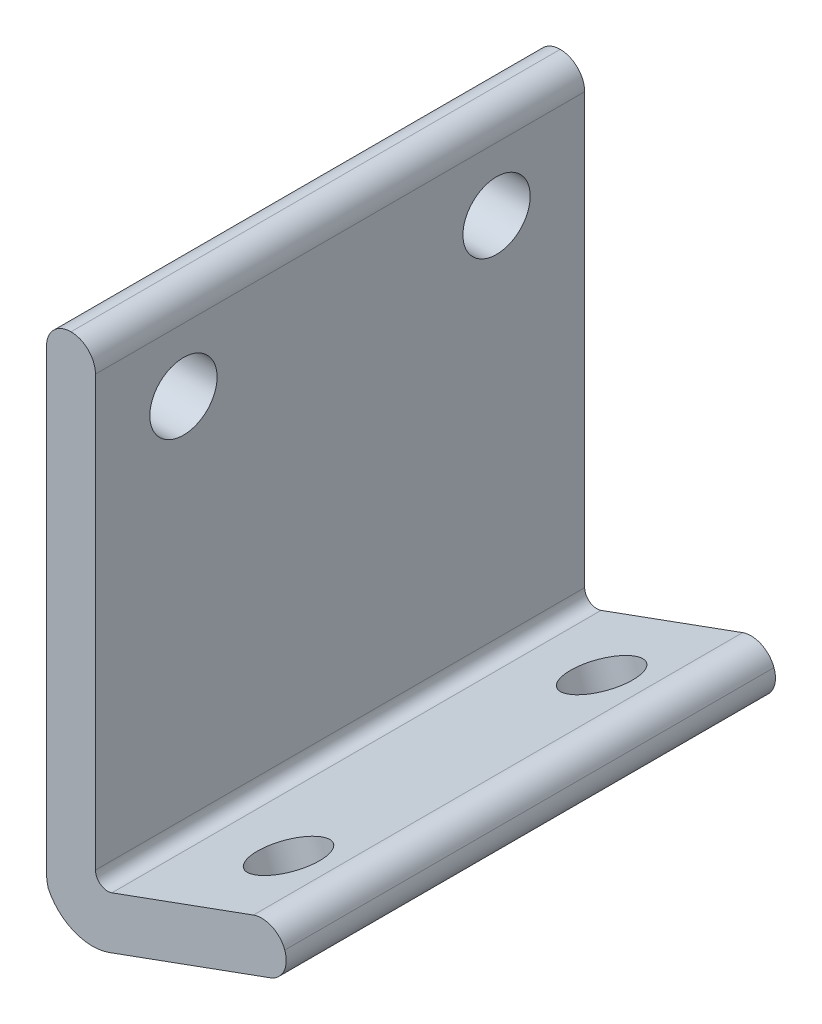
ISO-10303-21;
HEADER;
FILE_DESCRIPTION(('STEP AP214'),'2;1');
FILE_NAME('part.step','',(''),(''),'','','');
FILE_SCHEMA(('AUTOMOTIVE_DESIGN { 1 0 10303 214 1 1 1 1 }'));
ENDSEC;
DATA;
#1=APPLICATION_CONTEXT('core data for automotive mechanical design processes');
#2=APPLICATION_PROTOCOL_DEFINITION('international standard','automotive_design',2000,#1);
#3=PRODUCT_CONTEXT('',#1,'mechanical');
#4=PRODUCT('Part','Part','',(#3));
#5=PRODUCT_RELATED_PRODUCT_CATEGORY('part','',(#4));
#6=PRODUCT_DEFINITION_FORMATION('','',#4);
#7=PRODUCT_DEFINITION_CONTEXT('part definition',#1,'design');
#8=PRODUCT_DEFINITION('design','',#6,#7);
#9=PRODUCT_DEFINITION_SHAPE('','',#8);
#10=(LENGTH_UNIT() NAMED_UNIT(*) SI_UNIT(.MILLI.,.METRE.));
#11=(NAMED_UNIT(*) PLANE_ANGLE_UNIT() SI_UNIT($,.RADIAN.));
#12=(NAMED_UNIT(*) SI_UNIT($,.STERADIAN.) SOLID_ANGLE_UNIT());
#13=UNCERTAINTY_MEASURE_WITH_UNIT(LENGTH_MEASURE(1.E-05),#10,'distance_accuracy_value','');
#14=(GEOMETRIC_REPRESENTATION_CONTEXT(3) GLOBAL_UNCERTAINTY_ASSIGNED_CONTEXT((#13)) GLOBAL_UNIT_ASSIGNED_CONTEXT((#10,
#11,#12)) REPRESENTATION_CONTEXT('',''));
#15=CARTESIAN_POINT('',(0.,0.,0.));
#16=DIRECTION('',(0.,0.,1.));
#17=DIRECTION('',(1.,0.,0.));
#18=AXIS2_PLACEMENT_3D('',#15,#16,#17);
#19=CARTESIAN_POINT('',(0.,0.,0.));
#20=DIRECTION('',(-0.342020143325666,0.93969262078591,0.));
#21=DIRECTION('',(-0.939692620785909,-0.342020143325666,0.));
#22=AXIS2_PLACEMENT_3D('',#19,#20,#21);
#23=PLANE('',#22);
#24=CARTESIAN_POINT('',(6.29249955509349,2.29028253718733,-3.6));
#25=DIRECTION('',(0.342020143325666,-0.93969262078591,0.));
#26=DIRECTION('',(0.939692620785909,0.342020143325666,0.));
#27=AXIS2_PLACEMENT_3D('',#24,#25,#26);
#28=CIRCLE('',#27,1.35);
#29=CARTESIAN_POINT('',(7.56108459315447,2.75200973067698,-3.6));
#30=VERTEX_POINT('',#29);
#31=EDGE_CURVE('E160',#30,#30,#28,.T.);
#32=ORIENTED_EDGE('',*,*,#31,.T.);
#33=EDGE_LOOP('',(#32));
#34=FACE_BOUND('',#33,.T.);
#35=CARTESIAN_POINT('',(6.29249955509349,2.29028253718733,-16.4));
#36=DIRECTION('',(0.342020143325666,-0.93969262078591,0.));
#37=DIRECTION('',(0.939692620785909,0.342020143325666,0.));
#38=AXIS2_PLACEMENT_3D('',#35,#36,#37);
#39=CIRCLE('',#38,1.35);
#40=CARTESIAN_POINT('',(7.56108459315447,2.75200973067698,-16.4));
#41=VERTEX_POINT('',#40);
#42=EDGE_CURVE('E266',#41,#41,#39,.T.);
#43=ORIENTED_EDGE('',*,*,#42,.T.);
#44=EDGE_LOOP('',(#43));
#45=FACE_BOUND('',#44,.T.);
#46=DIRECTION('',(-0.939692620785909,-0.342020143325666,0.));
#47=VECTOR('',#46,1.);
#48=CARTESIAN_POINT('',(0.,0.,0.));
#49=LINE('',#48,#47);
#50=CARTESIAN_POINT('',(8.45723358707319,3.078181289931,0.));
#51=VERTEX_POINT('',#50);
#52=CARTESIAN_POINT('',(2.67101007166283,0.972168161510499,0.));
#53=VERTEX_POINT('',#52);
#54=EDGE_CURVE('E152',#51,#53,#49,.T.);
#55=ORIENTED_EDGE('',*,*,#54,.F.);
#56=DIRECTION('',(0.,0.,1.));
#57=VECTOR('',#56,1.);
#58=CARTESIAN_POINT('',(8.45723358707319,3.078181289931,-20.));
#59=LINE('',#58,#57);
#60=CARTESIAN_POINT('',(8.45723358707319,3.078181289931,-20.));
#61=VERTEX_POINT('',#60);
#62=EDGE_CURVE('E11',#51,#61,#59,.F.);
#63=ORIENTED_EDGE('',*,*,#62,.T.);
#64=DIRECTION('',(0.939692620785909,0.342020143325666,0.));
#65=VECTOR('',#64,1.);
#66=CARTESIAN_POINT('',(9.39692620785909,3.42020143325666,-20.));
#67=LINE('',#66,#65);
#68=CARTESIAN_POINT('',(2.67101007166283,0.972168161510499,-20.));
#69=VERTEX_POINT('',#68);
#70=EDGE_CURVE('E157',#69,#61,#67,.T.);
#71=ORIENTED_EDGE('',*,*,#70,.F.);
#72=DIRECTION('',(0.,0.,1.));
#73=VECTOR('',#72,1.);
#74=CARTESIAN_POINT('',(2.67101007166283,0.972168161510499,0.));
#75=LINE('',#74,#73);
#76=EDGE_CURVE('E177',#69,#53,#75,.T.);
#77=ORIENTED_EDGE('',*,*,#76,.T.);
#78=EDGE_LOOP('',(#55,#63,#71,#77));
#79=FACE_BOUND('',#78,.T.);
#80=ADVANCED_FACE('F39',(#34,#45,#79),#23,.T.);
#81=CARTESIAN_POINT('',(0.684040286651332,-1.87938524157182,0.));
#82=DIRECTION('',(-0.342020143325666,0.93969262078591,0.));
#83=DIRECTION('',(-0.939692620785909,-0.342020143325666,0.));
#84=AXIS2_PLACEMENT_3D('',#81,#82,#83);
#85=PLANE('',#84);
#86=DIRECTION('',(0.939692620785909,0.342020143325666,0.));
#87=VECTOR('',#86,1.);
#88=CARTESIAN_POINT('',(10.0809664945104,1.54081619168484,-20.));
#89=LINE('',#88,#87);
#90=CARTESIAN_POINT('',(2.56342552822315,-1.19534495492049,-20.));
#91=VERTEX_POINT('',#90);
#92=CARTESIAN_POINT('',(9.14127387372451,1.19879604835918,-20.));
#93=VERTEX_POINT('',#92);
#94=EDGE_CURVE('E142',#91,#93,#89,.T.);
#95=ORIENTED_EDGE('',*,*,#94,.T.);
#96=DIRECTION('',(0.,0.,1.));
#97=VECTOR('',#96,1.);
#98=CARTESIAN_POINT('',(9.14127387372451,1.19879604835918,0.));
#99=LINE('',#98,#97);
#100=CARTESIAN_POINT('',(9.14127387372451,1.19879604835918,0.));
#101=VERTEX_POINT('',#100);
#102=EDGE_CURVE('E214',#93,#101,#99,.T.);
#103=ORIENTED_EDGE('',*,*,#102,.T.);
#104=DIRECTION('',(-0.939692620785909,-0.342020143325666,0.));
#105=VECTOR('',#104,1.);
#106=CARTESIAN_POINT('',(0.684040286651332,-1.87938524157182,0.));
#107=LINE('',#106,#105);
#108=CARTESIAN_POINT('',(2.56342552822315,-1.19534495492049,0.));
#109=VERTEX_POINT('',#108);
#110=EDGE_CURVE('E145',#101,#109,#107,.T.);
#111=ORIENTED_EDGE('',*,*,#110,.T.);
#112=DIRECTION('',(0.,0.,-1.));
#113=VECTOR('',#112,1.);
#114=CARTESIAN_POINT('',(2.56342552822315,-1.19534495492049,0.));
#115=LINE('',#114,#113);
#116=EDGE_CURVE('E128',#109,#91,#115,.T.);
#117=ORIENTED_EDGE('',*,*,#116,.T.);
#118=EDGE_LOOP('',(#95,#103,#111,#117));
#119=FACE_BOUND('',#118,.T.);
#120=CARTESIAN_POINT('',(6.97653984174482,0.410897295615512,-3.6));
#121=DIRECTION('',(0.342020143325666,-0.93969262078591,0.));
#122=DIRECTION('',(0.939692620785909,0.342020143325666,0.));
#123=AXIS2_PLACEMENT_3D('',#120,#121,#122);
#124=CIRCLE('',#123,1.35);
#125=CARTESIAN_POINT('',(8.2451248798058,0.872624489105162,-3.6));
#126=VERTEX_POINT('',#125);
#127=EDGE_CURVE('E164',#126,#126,#124,.T.);
#128=ORIENTED_EDGE('',*,*,#127,.F.);
#129=EDGE_LOOP('',(#128));
#130=FACE_BOUND('',#129,.T.);
#131=CARTESIAN_POINT('',(6.97653984174482,0.410897295615512,-16.4));
#132=DIRECTION('',(0.342020143325666,-0.93969262078591,0.));
#133=DIRECTION('',(0.939692620785909,0.342020143325666,0.));
#134=AXIS2_PLACEMENT_3D('',#131,#132,#133);
#135=CIRCLE('',#134,1.35);
#136=CARTESIAN_POINT('',(8.2451248798058,0.872624489105161,-16.4));
#137=VERTEX_POINT('',#136);
#138=EDGE_CURVE('E270',#137,#137,#135,.T.);
#139=ORIENTED_EDGE('',*,*,#138,.F.);
#140=EDGE_LOOP('',(#139));
#141=FACE_BOUND('',#140,.T.);
#142=ADVANCED_FACE('F139',(#119,#130,#141),#85,.F.);
#143=CARTESIAN_POINT('',(10.0809664945104,1.54081619168484,-20.));
#144=DIRECTION('',(0.,0.,1.));
#145=DIRECTION('',(1.,0.,0.));
#146=AXIS2_PLACEMENT_3D('',#143,#144,#145);
#147=PLANE('',#146);
#148=CARTESIAN_POINT('',(8.79925373039885,2.13848866914509,-20.));
#149=DIRECTION('',(0.,0.,1.));
#150=DIRECTION('',(1.,0.,0.));
#151=AXIS2_PLACEMENT_3D('',#148,#149,#150);
#152=CIRCLE('',#151,1.);
#153=CARTESIAN_POINT('',(9.73894635118476,2.48050881247075,-20.));
#154=VERTEX_POINT('',#153);
#155=EDGE_CURVE('E56',#61,#154,#152,.F.);
#156=ORIENTED_EDGE('',*,*,#155,.T.);
#157=CARTESIAN_POINT('',(8.79925373039885,2.13848866914509,-20.));
#158=DIRECTION('',(0.,0.,1.));
#159=DIRECTION('',(1.,0.,0.));
#160=AXIS2_PLACEMENT_3D('',#157,#158,#159);
#161=CIRCLE('',#160,1.);
#162=EDGE_CURVE('E49',#154,#93,#161,.F.);
#163=ORIENTED_EDGE('',*,*,#162,.T.);
#164=ORIENTED_EDGE('',*,*,#94,.F.);
#165=CARTESIAN_POINT('',(1.87938524157182,0.684040286651332,-20.));
#166=DIRECTION('',(0.,0.,1.));
#167=DIRECTION('',(1.,0.,0.));
#168=AXIS2_PLACEMENT_3D('',#165,#166,#167);
#169=CIRCLE('',#168,2.);
#170=CARTESIAN_POINT('',(0.0676256716358873,-0.163029522010014,-20.));
#171=VERTEX_POINT('',#170);
#172=EDGE_CURVE('E124',#91,#171,#169,.F.);
#173=ORIENTED_EDGE('',*,*,#172,.T.);
#174=CARTESIAN_POINT('',(2.,0.352653961416928,-20.));
#175=DIRECTION('',(0.,0.,1.));
#176=DIRECTION('',(1.,0.,0.));
#177=AXIS2_PLACEMENT_3D('',#174,#175,#176);
#178=CIRCLE('',#177,2.);
#179=CARTESIAN_POINT('',(0.,0.352653961416927,-20.));
#180=VERTEX_POINT('',#179);
#181=EDGE_CURVE('E135',#171,#180,#178,.F.);
#182=ORIENTED_EDGE('',*,*,#181,.T.);
#183=DIRECTION('',(0.,1.,0.));
#184=VECTOR('',#183,1.);
#185=CARTESIAN_POINT('',(0.,20.,-20.));
#186=LINE('',#185,#184);
#187=CARTESIAN_POINT('',(0.,19.,-20.));
#188=VERTEX_POINT('',#187);
#189=EDGE_CURVE('E252',#180,#188,#186,.T.);
#190=ORIENTED_EDGE('',*,*,#189,.T.);
#191=CARTESIAN_POINT('',(1.,19.,-20.));
#192=DIRECTION('',(0.,0.,1.));
#193=DIRECTION('',(1.,0.,0.));
#194=AXIS2_PLACEMENT_3D('',#191,#192,#193);
#195=CIRCLE('',#194,1.);
#196=CARTESIAN_POINT('',(1.,20.,-20.));
#197=VERTEX_POINT('',#196);
#198=EDGE_CURVE('E205',#188,#197,#195,.F.);
#199=ORIENTED_EDGE('',*,*,#198,.T.);
#200=CARTESIAN_POINT('',(1.,19.,-20.));
#201=DIRECTION('',(0.,0.,1.));
#202=DIRECTION('',(1.,0.,0.));
#203=AXIS2_PLACEMENT_3D('',#200,#201,#202);
#204=CIRCLE('',#203,1.);
#205=CARTESIAN_POINT('',(2.,19.,-20.));
#206=VERTEX_POINT('',#205);
#207=EDGE_CURVE('E208',#197,#206,#204,.F.);
#208=ORIENTED_EDGE('',*,*,#207,.T.);
#209=DIRECTION('',(0.,1.,0.));
#210=VECTOR('',#209,1.);
#211=CARTESIAN_POINT('',(2.,20.,-20.));
#212=LINE('',#211,#210);
#213=CARTESIAN_POINT('',(2.,1.44201447190345,-20.));
#214=VERTEX_POINT('',#213);
#215=EDGE_CURVE('E259',#214,#206,#212,.T.);
#216=ORIENTED_EDGE('',*,*,#215,.F.);
#217=CARTESIAN_POINT('',(2.5,1.44201447190345,-20.));
#218=DIRECTION('',(0.,0.,1.));
#219=DIRECTION('',(1.,0.,0.));
#220=AXIS2_PLACEMENT_3D('',#217,#218,#219);
#221=CIRCLE('',#220,0.5);
#222=EDGE_CURVE('E192',#214,#69,#221,.T.);
#223=ORIENTED_EDGE('',*,*,#222,.T.);
#224=ORIENTED_EDGE('',*,*,#70,.T.);
#225=EDGE_LOOP('',(#156,#163,#164,#173,#182,#190,#199,#208,#216,#223,#224));
#226=FACE_BOUND('',#225,.T.);
#227=ADVANCED_FACE('F149',(#226),#147,.F.);
#228=CARTESIAN_POINT('',(0.684040286651332,-1.87938524157182,0.));
#229=DIRECTION('',(0.,0.,-1.));
#230=DIRECTION('',(-1.,0.,0.));
#231=AXIS2_PLACEMENT_3D('',#228,#229,#230);
#232=PLANE('',#231);
#233=ORIENTED_EDGE('',*,*,#110,.F.);
#234=CARTESIAN_POINT('',(8.79925373039885,2.13848866914509,0.));
#235=DIRECTION('',(0.,0.,-1.));
#236=DIRECTION('',(-1.,0.,0.));
#237=AXIS2_PLACEMENT_3D('',#234,#235,#236);
#238=CIRCLE('',#237,1.);
#239=CARTESIAN_POINT('',(9.73894635118476,2.48050881247075,0.));
#240=VERTEX_POINT('',#239);
#241=EDGE_CURVE('E223',#101,#240,#238,.F.);
#242=ORIENTED_EDGE('',*,*,#241,.T.);
#243=CARTESIAN_POINT('',(8.79925373039885,2.13848866914509,0.));
#244=DIRECTION('',(0.,0.,-1.));
#245=DIRECTION('',(-1.,0.,0.));
#246=AXIS2_PLACEMENT_3D('',#243,#244,#245);
#247=CIRCLE('',#246,1.);
#248=EDGE_CURVE('E220',#240,#51,#247,.F.);
#249=ORIENTED_EDGE('',*,*,#248,.T.);
#250=ORIENTED_EDGE('',*,*,#54,.T.);
#251=CARTESIAN_POINT('',(2.5,1.44201447190345,0.));
#252=DIRECTION('',(0.,0.,-1.));
#253=DIRECTION('',(-1.,0.,0.));
#254=AXIS2_PLACEMENT_3D('',#251,#252,#253);
#255=CIRCLE('',#254,0.5);
#256=CARTESIAN_POINT('',(2.,1.44201447190345,0.));
#257=VERTEX_POINT('',#256);
#258=EDGE_CURVE('E188',#53,#257,#255,.T.);
#259=ORIENTED_EDGE('',*,*,#258,.T.);
#260=DIRECTION('',(0.,-1.,0.));
#261=VECTOR('',#260,1.);
#262=CARTESIAN_POINT('',(2.,0.,0.));
#263=LINE('',#262,#261);
#264=CARTESIAN_POINT('',(2.,19.,0.));
#265=VERTEX_POINT('',#264);
#266=EDGE_CURVE('E263',#265,#257,#263,.T.);
#267=ORIENTED_EDGE('',*,*,#266,.F.);
#268=CARTESIAN_POINT('',(1.,19.,0.));
#269=DIRECTION('',(0.,0.,-1.));
#270=DIRECTION('',(-1.,0.,0.));
#271=AXIS2_PLACEMENT_3D('',#268,#269,#270);
#272=CIRCLE('',#271,1.);
#273=CARTESIAN_POINT('',(1.,20.,0.));
#274=VERTEX_POINT('',#273);
#275=EDGE_CURVE('E202',#265,#274,#272,.F.);
#276=ORIENTED_EDGE('',*,*,#275,.T.);
#277=CARTESIAN_POINT('',(1.,19.,0.));
#278=DIRECTION('',(0.,0.,-1.));
#279=DIRECTION('',(-1.,0.,0.));
#280=AXIS2_PLACEMENT_3D('',#277,#278,#279);
#281=CIRCLE('',#280,1.);
#282=CARTESIAN_POINT('',(0.,19.,0.));
#283=VERTEX_POINT('',#282);
#284=EDGE_CURVE('E199',#274,#283,#281,.F.);
#285=ORIENTED_EDGE('',*,*,#284,.T.);
#286=DIRECTION('',(0.,-1.,0.));
#287=VECTOR('',#286,1.);
#288=CARTESIAN_POINT('',(0.,0.,0.));
#289=LINE('',#288,#287);
#290=CARTESIAN_POINT('',(0.,0.352653961416928,0.));
#291=VERTEX_POINT('',#290);
#292=EDGE_CURVE('E256',#283,#291,#289,.T.);
#293=ORIENTED_EDGE('',*,*,#292,.T.);
#294=CARTESIAN_POINT('',(2.,0.352653961416928,0.));
#295=DIRECTION('',(0.,0.,-1.));
#296=DIRECTION('',(-1.,0.,0.));
#297=AXIS2_PLACEMENT_3D('',#294,#295,#296);
#298=CIRCLE('',#297,2.);
#299=CARTESIAN_POINT('',(0.0676256716358873,-0.163029522010014,0.));
#300=VERTEX_POINT('',#299);
#301=EDGE_CURVE('E134',#291,#300,#298,.F.);
#302=ORIENTED_EDGE('',*,*,#301,.T.);
#303=CARTESIAN_POINT('',(1.87938524157182,0.684040286651332,0.));
#304=DIRECTION('',(0.,0.,-1.));
#305=DIRECTION('',(-1.,0.,0.));
#306=AXIS2_PLACEMENT_3D('',#303,#304,#305);
#307=CIRCLE('',#306,2.);
#308=EDGE_CURVE('E170',#300,#109,#307,.F.);
#309=ORIENTED_EDGE('',*,*,#308,.T.);
#310=EDGE_LOOP('',(#233,#242,#249,#250,#259,#267,#276,#285,#293,#302,#309));
#311=FACE_BOUND('',#310,.T.);
#312=ADVANCED_FACE('F231',(#311),#232,.F.);
#313=CARTESIAN_POINT('',(6.97653984174482,0.410897295615512,-3.6));
#314=DIRECTION('',(-0.342020143325666,0.939692620785909,0.));
#315=DIRECTION('',(-0.93969262078591,-0.342020143325666,0.));
#316=AXIS2_PLACEMENT_3D('',#313,#314,#315);
#317=CYLINDRICAL_SURFACE('',#316,1.35);
#318=ORIENTED_EDGE('',*,*,#127,.T.);
#319=EDGE_LOOP('',(#318));
#320=FACE_BOUND('',#319,.T.);
#321=ORIENTED_EDGE('',*,*,#31,.F.);
#322=EDGE_LOOP('',(#321));
#323=FACE_BOUND('',#322,.T.);
#324=ADVANCED_FACE('F280',(#320,#323),#317,.F.);
#325=CARTESIAN_POINT('',(6.97653984174482,0.410897295615512,-16.4));
#326=DIRECTION('',(-0.342020143325666,0.939692620785909,0.));
#327=DIRECTION('',(-0.93969262078591,-0.342020143325666,0.));
#328=AXIS2_PLACEMENT_3D('',#325,#326,#327);
#329=CYLINDRICAL_SURFACE('',#328,1.35);
#330=ORIENTED_EDGE('',*,*,#138,.T.);
#331=EDGE_LOOP('',(#330));
#332=FACE_BOUND('',#331,.T.);
#333=ORIENTED_EDGE('',*,*,#42,.F.);
#334=EDGE_LOOP('',(#333));
#335=FACE_BOUND('',#334,.T.);
#336=ADVANCED_FACE('F287',(#332,#335),#329,.F.);
#337=CARTESIAN_POINT('',(2.,0.,0.));
#338=DIRECTION('',(-1.,0.,0.));
#339=DIRECTION('',(0.,0.,1.));
#340=AXIS2_PLACEMENT_3D('',#337,#338,#339);
#341=PLANE('',#340);
#342=ORIENTED_EDGE('',*,*,#215,.T.);
#343=DIRECTION('',(0.,0.,1.));
#344=VECTOR('',#343,1.);
#345=CARTESIAN_POINT('',(2.,19.,0.));
#346=LINE('',#345,#344);
#347=EDGE_CURVE('E195',#206,#265,#346,.T.);
#348=ORIENTED_EDGE('',*,*,#347,.T.);
#349=ORIENTED_EDGE('',*,*,#266,.T.);
#350=DIRECTION('',(0.,0.,1.));
#351=VECTOR('',#350,1.);
#352=CARTESIAN_POINT('',(2.,1.44201447190345,0.));
#353=LINE('',#352,#351);
#354=EDGE_CURVE('E185',#257,#214,#353,.F.);
#355=ORIENTED_EDGE('',*,*,#354,.T.);
#356=EDGE_LOOP('',(#342,#348,#349,#355));
#357=FACE_BOUND('',#356,.T.);
#358=CARTESIAN_POINT('',(2.,16.4156081962162,-3.59710060147989));
#359=DIRECTION('',(1.,0.,0.));
#360=DIRECTION('',(0.,0.,-1.));
#361=AXIS2_PLACEMENT_3D('',#358,#359,#360);
#362=CIRCLE('',#361,1.375);
#363=CARTESIAN_POINT('',(2.,16.4156081962162,-4.97210060147989));
#364=VERTEX_POINT('',#363);
#365=EDGE_CURVE('E248',#364,#364,#362,.T.);
#366=ORIENTED_EDGE('',*,*,#365,.F.);
#367=EDGE_LOOP('',(#366));
#368=FACE_BOUND('',#367,.T.);
#369=CARTESIAN_POINT('',(2.,16.4156081962162,-16.3971006014799));
#370=DIRECTION('',(1.,0.,0.));
#371=DIRECTION('',(0.,0.,-1.));
#372=AXIS2_PLACEMENT_3D('',#369,#370,#371);
#373=CIRCLE('',#372,1.375);
#374=CARTESIAN_POINT('',(2.,16.4156081962162,-17.7721006014799));
#375=VERTEX_POINT('',#374);
#376=EDGE_CURVE('E240',#375,#375,#373,.T.);
#377=ORIENTED_EDGE('',*,*,#376,.F.);
#378=EDGE_LOOP('',(#377));
#379=FACE_BOUND('',#378,.T.);
#380=ADVANCED_FACE('F290',(#357,#368,#379),#341,.F.);
#381=CARTESIAN_POINT('',(0.,0.,0.));
#382=DIRECTION('',(-1.,0.,0.));
#383=DIRECTION('',(0.,0.,1.));
#384=AXIS2_PLACEMENT_3D('',#381,#382,#383);
#385=PLANE('',#384);
#386=CARTESIAN_POINT('',(0.,16.4156081962162,-3.59710060147989));
#387=DIRECTION('',(1.,0.,0.));
#388=DIRECTION('',(0.,0.,-1.));
#389=AXIS2_PLACEMENT_3D('',#386,#387,#388);
#390=CIRCLE('',#389,1.375);
#391=CARTESIAN_POINT('',(0.,16.4156081962162,-4.97210060147989));
#392=VERTEX_POINT('',#391);
#393=EDGE_CURVE('E244',#392,#392,#390,.T.);
#394=ORIENTED_EDGE('',*,*,#393,.T.);
#395=EDGE_LOOP('',(#394));
#396=FACE_BOUND('',#395,.T.);
#397=ORIENTED_EDGE('',*,*,#292,.F.);
#398=DIRECTION('',(0.,0.,1.));
#399=VECTOR('',#398,1.);
#400=CARTESIAN_POINT('',(0.,19.,-20.));
#401=LINE('',#400,#399);
#402=EDGE_CURVE('E211',#283,#188,#401,.F.);
#403=ORIENTED_EDGE('',*,*,#402,.T.);
#404=ORIENTED_EDGE('',*,*,#189,.F.);
#405=DIRECTION('',(0.,0.,-1.));
#406=VECTOR('',#405,1.);
#407=CARTESIAN_POINT('',(0.,0.352653961416928,0.));
#408=LINE('',#407,#406);
#409=EDGE_CURVE('E173',#180,#291,#408,.F.);
#410=ORIENTED_EDGE('',*,*,#409,.T.);
#411=EDGE_LOOP('',(#397,#403,#404,#410));
#412=FACE_BOUND('',#411,.T.);
#413=CARTESIAN_POINT('',(0.,16.4156081962162,-16.3971006014799));
#414=DIRECTION('',(1.,0.,0.));
#415=DIRECTION('',(0.,0.,-1.));
#416=AXIS2_PLACEMENT_3D('',#413,#414,#415);
#417=CIRCLE('',#416,1.375);
#418=CARTESIAN_POINT('',(0.,16.4156081962162,-17.7721006014799));
#419=VERTEX_POINT('',#418);
#420=EDGE_CURVE('E180',#419,#419,#417,.T.);
#421=ORIENTED_EDGE('',*,*,#420,.T.);
#422=EDGE_LOOP('',(#421));
#423=FACE_BOUND('',#422,.T.);
#424=ADVANCED_FACE('F320',(#396,#412,#423),#385,.T.);
#425=CARTESIAN_POINT('',(2.,16.4156081962162,-3.59710060147989));
#426=DIRECTION('',(-1.,0.,0.));
#427=DIRECTION('',(0.,0.,1.));
#428=AXIS2_PLACEMENT_3D('',#425,#426,#427);
#429=CYLINDRICAL_SURFACE('',#428,1.375);
#430=ORIENTED_EDGE('',*,*,#365,.T.);
#431=EDGE_LOOP('',(#430));
#432=FACE_BOUND('',#431,.T.);
#433=ORIENTED_EDGE('',*,*,#393,.F.);
#434=EDGE_LOOP('',(#433));
#435=FACE_BOUND('',#434,.T.);
#436=ADVANCED_FACE('F334',(#432,#435),#429,.F.);
#437=CARTESIAN_POINT('',(2.,16.4156081962162,-16.3971006014799));
#438=DIRECTION('',(-1.,0.,0.));
#439=DIRECTION('',(0.,0.,1.));
#440=AXIS2_PLACEMENT_3D('',#437,#438,#439);
#441=CYLINDRICAL_SURFACE('',#440,1.375);
#442=ORIENTED_EDGE('',*,*,#376,.T.);
#443=EDGE_LOOP('',(#442));
#444=FACE_BOUND('',#443,.T.);
#445=ORIENTED_EDGE('',*,*,#420,.F.);
#446=EDGE_LOOP('',(#445));
#447=FACE_BOUND('',#446,.T.);
#448=ADVANCED_FACE('F327',(#444,#447),#441,.F.);
#449=CARTESIAN_POINT('',(2.,0.352653961416928,-20.));
#450=DIRECTION('',(0.,0.,1.));
#451=DIRECTION('',(1.,0.,0.));
#452=AXIS2_PLACEMENT_3D('',#449,#450,#451);
#453=CYLINDRICAL_SURFACE('',#452,2.);
#454=DIRECTION('',(0.,0.,1.));
#455=VECTOR('',#454,1.);
#456=CARTESIAN_POINT('',(0.0676256716358873,-0.163029522010014,-10.));
#457=LINE('',#456,#455);
#458=EDGE_CURVE('E130',#300,#171,#457,.F.);
#459=ORIENTED_EDGE('',*,*,#458,.F.);
#460=ORIENTED_EDGE('',*,*,#301,.F.);
#461=ORIENTED_EDGE('',*,*,#409,.F.);
#462=ORIENTED_EDGE('',*,*,#181,.F.);
#463=EDGE_LOOP('',(#459,#460,#461,#462));
#464=FACE_BOUND('',#463,.T.);
#465=ADVANCED_FACE('F324',(#464),#453,.T.);
#466=CARTESIAN_POINT('',(1.87938524157182,0.684040286651332,0.));
#467=DIRECTION('',(0.,0.,-1.));
#468=DIRECTION('',(-1.,0.,0.));
#469=AXIS2_PLACEMENT_3D('',#466,#467,#468);
#470=CYLINDRICAL_SURFACE('',#469,2.);
#471=ORIENTED_EDGE('',*,*,#308,.F.);
#472=ORIENTED_EDGE('',*,*,#458,.T.);
#473=ORIENTED_EDGE('',*,*,#172,.F.);
#474=ORIENTED_EDGE('',*,*,#116,.F.);
#475=EDGE_LOOP('',(#471,#472,#473,#474));
#476=FACE_BOUND('',#475,.T.);
#477=ADVANCED_FACE('F127',(#476),#470,.T.);
#478=CARTESIAN_POINT('',(2.5,1.44201447190345,0.));
#479=DIRECTION('',(0.,0.,1.));
#480=DIRECTION('',(1.,0.,0.));
#481=AXIS2_PLACEMENT_3D('',#478,#479,#480);
#482=CYLINDRICAL_SURFACE('',#481,0.5);
#483=ORIENTED_EDGE('',*,*,#222,.F.);
#484=ORIENTED_EDGE('',*,*,#354,.F.);
#485=ORIENTED_EDGE('',*,*,#258,.F.);
#486=ORIENTED_EDGE('',*,*,#76,.F.);
#487=EDGE_LOOP('',(#483,#484,#485,#486));
#488=FACE_BOUND('',#487,.T.);
#489=ADVANCED_FACE('F303',(#488),#482,.F.);
#490=CARTESIAN_POINT('',(1.,19.,0.));
#491=DIRECTION('',(0.,0.,-1.));
#492=DIRECTION('',(-1.,0.,0.));
#493=AXIS2_PLACEMENT_3D('',#490,#491,#492);
#494=CYLINDRICAL_SURFACE('',#493,1.);
#495=DIRECTION('',(0.,0.,1.));
#496=VECTOR('',#495,1.);
#497=CARTESIAN_POINT('',(1.,20.,0.));
#498=LINE('',#497,#496);
#499=EDGE_CURVE('E181',#197,#274,#498,.T.);
#500=ORIENTED_EDGE('',*,*,#499,.F.);
#501=ORIENTED_EDGE('',*,*,#198,.F.);
#502=ORIENTED_EDGE('',*,*,#402,.F.);
#503=ORIENTED_EDGE('',*,*,#284,.F.);
#504=EDGE_LOOP('',(#500,#501,#502,#503));
#505=FACE_BOUND('',#504,.T.);
#506=ADVANCED_FACE('F317',(#505),#494,.T.);
#507=CARTESIAN_POINT('',(1.,19.,0.));
#508=DIRECTION('',(0.,0.,1.));
#509=DIRECTION('',(1.,0.,0.));
#510=AXIS2_PLACEMENT_3D('',#507,#508,#509);
#511=CYLINDRICAL_SURFACE('',#510,1.);
#512=ORIENTED_EDGE('',*,*,#207,.F.);
#513=ORIENTED_EDGE('',*,*,#499,.T.);
#514=ORIENTED_EDGE('',*,*,#275,.F.);
#515=ORIENTED_EDGE('',*,*,#347,.F.);
#516=EDGE_LOOP('',(#512,#513,#514,#515));
#517=FACE_BOUND('',#516,.T.);
#518=ADVANCED_FACE('F312',(#517),#511,.T.);
#519=CARTESIAN_POINT('',(8.79925373039885,2.13848866914509,0.));
#520=DIRECTION('',(0.,0.,-1.));
#521=DIRECTION('',(-1.,0.,0.));
#522=AXIS2_PLACEMENT_3D('',#519,#520,#521);
#523=CYLINDRICAL_SURFACE('',#522,1.);
#524=DIRECTION('',(0.,0.,1.));
#525=VECTOR('',#524,1.);
#526=CARTESIAN_POINT('',(9.73894635118476,2.48050881247075,0.));
#527=LINE('',#526,#525);
#528=EDGE_CURVE('E43',#154,#240,#527,.T.);
#529=ORIENTED_EDGE('',*,*,#528,.F.);
#530=ORIENTED_EDGE('',*,*,#155,.F.);
#531=ORIENTED_EDGE('',*,*,#62,.F.);
#532=ORIENTED_EDGE('',*,*,#248,.F.);
#533=EDGE_LOOP('',(#529,#530,#531,#532));
#534=FACE_BOUND('',#533,.T.);
#535=ADVANCED_FACE('F41',(#534),#523,.T.);
#536=CARTESIAN_POINT('',(8.79925373039885,2.13848866914509,0.));
#537=DIRECTION('',(0.,0.,1.));
#538=DIRECTION('',(1.,0.,0.));
#539=AXIS2_PLACEMENT_3D('',#536,#537,#538);
#540=CYLINDRICAL_SURFACE('',#539,1.);
#541=ORIENTED_EDGE('',*,*,#162,.F.);
#542=ORIENTED_EDGE('',*,*,#528,.T.);
#543=ORIENTED_EDGE('',*,*,#241,.F.);
#544=ORIENTED_EDGE('',*,*,#102,.F.);
#545=EDGE_LOOP('',(#541,#542,#543,#544));
#546=FACE_BOUND('',#545,.T.);
#547=ADVANCED_FACE('F235',(#546),#540,.T.);
#548=CLOSED_SHELL('',(#80,#142,#227,#312,#324,#336,#380,#424,#436,#448,#465,#477,#489,#506,#518,
#535,#547));
#549=MANIFOLD_SOLID_BREP('B2',#548);
#550=ADVANCED_BREP_SHAPE_REPRESENTATION('',(#18,#549),#14);
#551=SHAPE_DEFINITION_REPRESENTATION(#9,#550);
ENDSEC;
END-ISO-10303-21;
